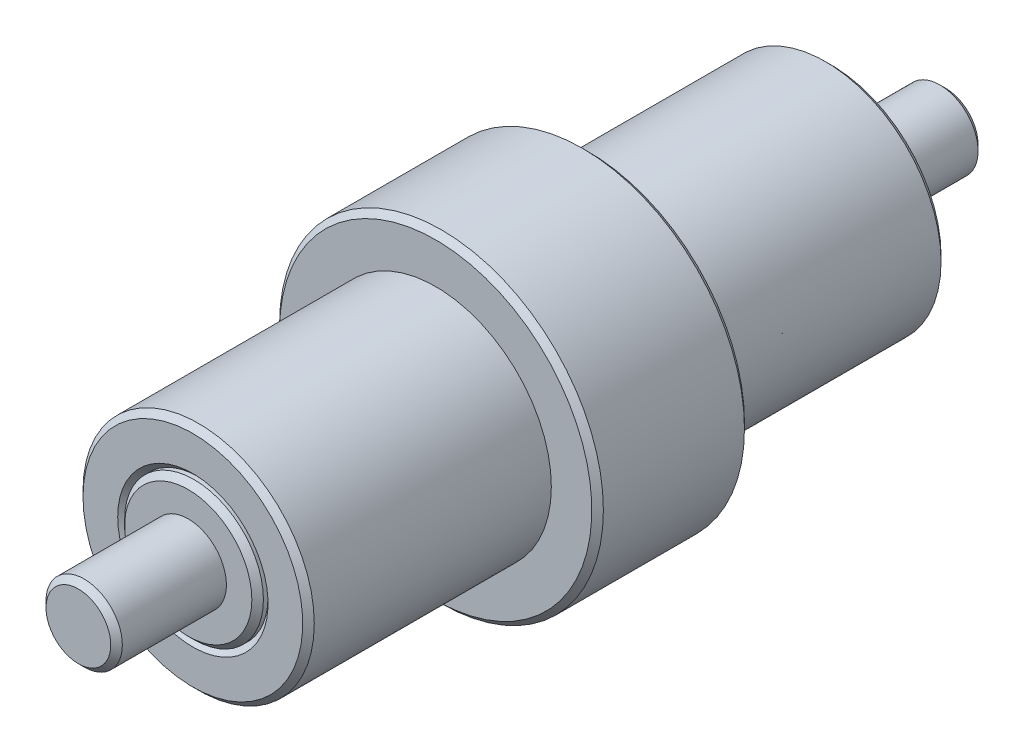
ISO-10303-21;
HEADER;
FILE_DESCRIPTION(('STEP AP214'),'2;1');
FILE_NAME('part.step','',(''),(''),'','','');
FILE_SCHEMA(('AUTOMOTIVE_DESIGN { 1 0 10303 214 1 1 1 1 }'));
ENDSEC;
DATA;
#1=APPLICATION_CONTEXT('core data for automotive mechanical design processes');
#2=APPLICATION_PROTOCOL_DEFINITION('international standard','automotive_design',2000,#1);
#3=PRODUCT_CONTEXT('',#1,'mechanical');
#4=PRODUCT('Part','Part','',(#3));
#5=PRODUCT_RELATED_PRODUCT_CATEGORY('part','',(#4));
#6=PRODUCT_DEFINITION_FORMATION('','',#4);
#7=PRODUCT_DEFINITION_CONTEXT('part definition',#1,'design');
#8=PRODUCT_DEFINITION('design','',#6,#7);
#9=PRODUCT_DEFINITION_SHAPE('','',#8);
#10=(LENGTH_UNIT() NAMED_UNIT(*) SI_UNIT(.MILLI.,.METRE.));
#11=(NAMED_UNIT(*) PLANE_ANGLE_UNIT() SI_UNIT($,.RADIAN.));
#12=(NAMED_UNIT(*) SI_UNIT($,.STERADIAN.) SOLID_ANGLE_UNIT());
#13=UNCERTAINTY_MEASURE_WITH_UNIT(LENGTH_MEASURE(1.E-05),#10,'distance_accuracy_value','');
#14=(GEOMETRIC_REPRESENTATION_CONTEXT(3) GLOBAL_UNCERTAINTY_ASSIGNED_CONTEXT((#13)) GLOBAL_UNIT_ASSIGNED_CONTEXT((#10,
#11,#12)) REPRESENTATION_CONTEXT('',''));
#15=CARTESIAN_POINT('',(0.,0.,0.));
#16=DIRECTION('',(0.,0.,1.));
#17=DIRECTION('',(1.,0.,0.));
#18=AXIS2_PLACEMENT_3D('',#15,#16,#17);
#19=CARTESIAN_POINT('',(0.,0.,13.8));
#20=DIRECTION('',(0.,0.,1.));
#21=DIRECTION('',(1.,0.,0.));
#22=AXIS2_PLACEMENT_3D('',#19,#20,#21);
#23=CYLINDRICAL_SURFACE('',#22,3.);
#24=CARTESIAN_POINT('',(0.,0.,-13.55));
#25=DIRECTION('',(0.,0.,1.));
#26=DIRECTION('',(1.,0.,0.));
#27=AXIS2_PLACEMENT_3D('',#24,#25,#26);
#28=CIRCLE('',#27,3.);
#29=CARTESIAN_POINT('',(3.,0.,-13.55));
#30=VERTEX_POINT('',#29);
#31=EDGE_CURVE('P0_E48',#30,#30,#28,.F.);
#32=ORIENTED_EDGE('',*,*,#31,.T.);
#33=EDGE_LOOP('',(#32));
#34=FACE_BOUND('',#33,.T.);
#35=CARTESIAN_POINT('',(0.,0.,13.55));
#36=DIRECTION('',(0.,0.,-1.));
#37=DIRECTION('',(-1.,0.,0.));
#38=AXIS2_PLACEMENT_3D('',#35,#36,#37);
#39=CIRCLE('',#38,3.);
#40=CARTESIAN_POINT('',(-3.,0.,13.55));
#41=VERTEX_POINT('',#40);
#42=EDGE_CURVE('P0_E51',#41,#41,#39,.F.);
#43=ORIENTED_EDGE('',*,*,#42,.T.);
#44=EDGE_LOOP('',(#43));
#45=FACE_BOUND('',#44,.T.);
#46=ADVANCED_FACE('P0_F15',(#34,#45),#23,.F.);
#47=CARTESIAN_POINT('',(0.,3.,13.8));
#48=DIRECTION('',(0.,0.,-1.));
#49=DIRECTION('',(-1.,0.,0.));
#50=AXIS2_PLACEMENT_3D('',#47,#48,#49);
#51=PLANE('',#50);
#52=CARTESIAN_POINT('',(0.,0.,13.8));
#53=DIRECTION('',(0.,0.,-1.));
#54=DIRECTION('',(-1.,0.,0.));
#55=AXIS2_PLACEMENT_3D('',#52,#53,#54);
#56=CIRCLE('',#55,3.25);
#57=CARTESIAN_POINT('',(-3.25,0.,13.8));
#58=VERTEX_POINT('',#57);
#59=EDGE_CURVE('P0_E27',#58,#58,#56,.T.);
#60=ORIENTED_EDGE('',*,*,#59,.T.);
#61=EDGE_LOOP('',(#60));
#62=FACE_BOUND('',#61,.T.);
#63=CARTESIAN_POINT('',(0.,0.,13.8));
#64=DIRECTION('',(0.,0.,-1.));
#65=DIRECTION('',(-1.,0.,0.));
#66=AXIS2_PLACEMENT_3D('',#63,#64,#65);
#67=CIRCLE('',#66,4.74999999999999);
#68=CARTESIAN_POINT('',(-4.74999999999999,0.,13.8));
#69=VERTEX_POINT('',#68);
#70=EDGE_CURVE('P0_E31',#69,#69,#67,.F.);
#71=ORIENTED_EDGE('',*,*,#70,.T.);
#72=EDGE_LOOP('',(#71));
#73=FACE_BOUND('',#72,.T.);
#74=ADVANCED_FACE('P0_F86',(#62,#73),#51,.F.);
#75=CARTESIAN_POINT('',(0.,0.,13.8));
#76=DIRECTION('',(0.,0.,1.));
#77=DIRECTION('',(1.,0.,0.));
#78=AXIS2_PLACEMENT_3D('',#75,#76,#77);
#79=CYLINDRICAL_SURFACE('',#78,5.);
#80=CARTESIAN_POINT('',(0.,0.,13.55));
#81=DIRECTION('',(0.,0.,-1.));
#82=DIRECTION('',(-1.,0.,0.));
#83=AXIS2_PLACEMENT_3D('',#80,#81,#82);
#84=CIRCLE('',#83,5.);
#85=CARTESIAN_POINT('',(-5.,0.,13.55));
#86=VERTEX_POINT('',#85);
#87=EDGE_CURVE('P0_E23',#86,#86,#84,.T.);
#88=ORIENTED_EDGE('',*,*,#87,.T.);
#89=EDGE_LOOP('',(#88));
#90=FACE_BOUND('',#89,.T.);
#91=CARTESIAN_POINT('',(0.,0.,3.3));
#92=DIRECTION('',(0.,0.,1.));
#93=DIRECTION('',(1.,0.,0.));
#94=AXIS2_PLACEMENT_3D('',#91,#92,#93);
#95=CIRCLE('',#94,5.);
#96=CARTESIAN_POINT('',(5.,0.,3.3));
#97=VERTEX_POINT('',#96);
#98=EDGE_CURVE('P0_E60',#97,#97,#95,.T.);
#99=ORIENTED_EDGE('',*,*,#98,.T.);
#100=EDGE_LOOP('',(#99));
#101=FACE_BOUND('',#100,.T.);
#102=ADVANCED_FACE('P0_F92',(#90,#101),#79,.T.);
#103=CARTESIAN_POINT('',(0.,5.,3.3));
#104=DIRECTION('',(0.,0.,-1.));
#105=DIRECTION('',(-1.,0.,0.));
#106=AXIS2_PLACEMENT_3D('',#103,#104,#105);
#107=PLANE('',#106);
#108=CARTESIAN_POINT('',(0.,0.,3.3));
#109=DIRECTION('',(0.,0.,-1.));
#110=DIRECTION('',(-1.,0.,0.));
#111=AXIS2_PLACEMENT_3D('',#108,#109,#110);
#112=CIRCLE('',#111,6.75);
#113=CARTESIAN_POINT('',(-6.75,0.,3.3));
#114=VERTEX_POINT('',#113);
#115=EDGE_CURVE('P0_E10',#114,#114,#112,.F.);
#116=ORIENTED_EDGE('',*,*,#115,.T.);
#117=EDGE_LOOP('',(#116));
#118=FACE_BOUND('',#117,.T.);
#119=ORIENTED_EDGE('',*,*,#98,.F.);
#120=EDGE_LOOP('',(#119));
#121=FACE_BOUND('',#120,.T.);
#122=ADVANCED_FACE('P0_F144',(#118,#121),#107,.F.);
#123=CARTESIAN_POINT('',(0.,0.,13.8));
#124=DIRECTION('',(0.,0.,1.));
#125=DIRECTION('',(1.,0.,0.));
#126=AXIS2_PLACEMENT_3D('',#123,#124,#125);
#127=CYLINDRICAL_SURFACE('',#126,7.);
#128=CARTESIAN_POINT('',(0.,0.,-3.05));
#129=DIRECTION('',(0.,0.,1.));
#130=DIRECTION('',(1.,0.,0.));
#131=AXIS2_PLACEMENT_3D('',#128,#129,#130);
#132=CIRCLE('',#131,7.);
#133=CARTESIAN_POINT('',(7.,0.,-3.05));
#134=VERTEX_POINT('',#133);
#135=EDGE_CURVE('P0_E39',#134,#134,#132,.T.);
#136=ORIENTED_EDGE('',*,*,#135,.T.);
#137=EDGE_LOOP('',(#136));
#138=FACE_BOUND('',#137,.T.);
#139=CARTESIAN_POINT('',(0.,0.,3.05));
#140=DIRECTION('',(0.,0.,-1.));
#141=DIRECTION('',(-1.,0.,0.));
#142=AXIS2_PLACEMENT_3D('',#139,#140,#141);
#143=CIRCLE('',#142,7.);
#144=CARTESIAN_POINT('',(-7.,0.,3.05));
#145=VERTEX_POINT('',#144);
#146=EDGE_CURVE('P0_E42',#145,#145,#143,.T.);
#147=ORIENTED_EDGE('',*,*,#146,.T.);
#148=EDGE_LOOP('',(#147));
#149=FACE_BOUND('',#148,.T.);
#150=ADVANCED_FACE('P0_F82',(#138,#149),#127,.T.);
#151=CARTESIAN_POINT('',(0.,7.,-3.3));
#152=DIRECTION('',(0.,0.,1.));
#153=DIRECTION('',(1.,0.,0.));
#154=AXIS2_PLACEMENT_3D('',#151,#152,#153);
#155=PLANE('',#154);
#156=CARTESIAN_POINT('',(0.,0.,-3.3));
#157=DIRECTION('',(0.,0.,1.));
#158=DIRECTION('',(1.,0.,0.));
#159=AXIS2_PLACEMENT_3D('',#156,#157,#158);
#160=CIRCLE('',#159,6.75);
#161=CARTESIAN_POINT('',(6.75,0.,-3.3));
#162=VERTEX_POINT('',#161);
#163=EDGE_CURVE('P0_E36',#162,#162,#160,.F.);
#164=ORIENTED_EDGE('',*,*,#163,.T.);
#165=EDGE_LOOP('',(#164));
#166=FACE_BOUND('',#165,.T.);
#167=CARTESIAN_POINT('',(0.,0.,-3.3));
#168=DIRECTION('',(0.,0.,1.));
#169=DIRECTION('',(1.,0.,0.));
#170=AXIS2_PLACEMENT_3D('',#167,#168,#169);
#171=CIRCLE('',#170,5.);
#172=CARTESIAN_POINT('',(5.,0.,-3.3));
#173=VERTEX_POINT('',#172);
#174=EDGE_CURVE('P0_E63',#173,#173,#171,.T.);
#175=ORIENTED_EDGE('',*,*,#174,.T.);
#176=EDGE_LOOP('',(#175));
#177=FACE_BOUND('',#176,.T.);
#178=ADVANCED_FACE('P0_F67',(#166,#177),#155,.F.);
#179=CARTESIAN_POINT('',(0.,0.,13.8));
#180=DIRECTION('',(0.,0.,1.));
#181=DIRECTION('',(1.,0.,0.));
#182=AXIS2_PLACEMENT_3D('',#179,#180,#181);
#183=CYLINDRICAL_SURFACE('',#182,5.);
#184=CARTESIAN_POINT('',(0.,0.,-13.55));
#185=DIRECTION('',(0.,0.,1.));
#186=DIRECTION('',(1.,0.,0.));
#187=AXIS2_PLACEMENT_3D('',#184,#185,#186);
#188=CIRCLE('',#187,5.);
#189=CARTESIAN_POINT('',(5.,0.,-13.55));
#190=VERTEX_POINT('',#189);
#191=EDGE_CURVE('P0_E45',#190,#190,#188,.T.);
#192=ORIENTED_EDGE('',*,*,#191,.T.);
#193=EDGE_LOOP('',(#192));
#194=FACE_BOUND('',#193,.T.);
#195=ORIENTED_EDGE('',*,*,#174,.F.);
#196=EDGE_LOOP('',(#195));
#197=FACE_BOUND('',#196,.T.);
#198=ADVANCED_FACE('P0_F69',(#194,#197),#183,.T.);
#199=CARTESIAN_POINT('',(0.,5.,-13.8));
#200=DIRECTION('',(0.,0.,1.));
#201=DIRECTION('',(1.,0.,0.));
#202=AXIS2_PLACEMENT_3D('',#199,#200,#201);
#203=PLANE('',#202);
#204=CARTESIAN_POINT('',(0.,0.,-13.8));
#205=DIRECTION('',(0.,0.,1.));
#206=DIRECTION('',(1.,0.,0.));
#207=AXIS2_PLACEMENT_3D('',#204,#205,#206);
#208=CIRCLE('',#207,3.25000000000001);
#209=CARTESIAN_POINT('',(3.25000000000001,0.,-13.8));
#210=VERTEX_POINT('',#209);
#211=EDGE_CURVE('P0_E54',#210,#210,#208,.T.);
#212=ORIENTED_EDGE('',*,*,#211,.T.);
#213=EDGE_LOOP('',(#212));
#214=FACE_BOUND('',#213,.T.);
#215=CARTESIAN_POINT('',(0.,0.,-13.8));
#216=DIRECTION('',(0.,0.,1.));
#217=DIRECTION('',(1.,0.,0.));
#218=AXIS2_PLACEMENT_3D('',#215,#216,#217);
#219=CIRCLE('',#218,4.75);
#220=CARTESIAN_POINT('',(4.75,0.,-13.8));
#221=VERTEX_POINT('',#220);
#222=EDGE_CURVE('P0_E57',#221,#221,#219,.F.);
#223=ORIENTED_EDGE('',*,*,#222,.T.);
#224=EDGE_LOOP('',(#223));
#225=FACE_BOUND('',#224,.T.);
#226=ADVANCED_FACE('P0_F71',(#214,#225),#203,.F.);
#227=CARTESIAN_POINT('',(0.,0.,-13.8));
#228=DIRECTION('',(0.,0.,-1.));
#229=DIRECTION('',(-1.,0.,0.));
#230=AXIS2_PLACEMENT_3D('',#227,#228,#229);
#231=CONICAL_SURFACE('',#230,3.25000000000001,0.78539816339745);
#232=ORIENTED_EDGE('',*,*,#31,.F.);
#233=EDGE_LOOP('',(#232));
#234=FACE_BOUND('',#233,.T.);
#235=ORIENTED_EDGE('',*,*,#211,.F.);
#236=EDGE_LOOP('',(#235));
#237=FACE_BOUND('',#236,.T.);
#238=ADVANCED_FACE('P0_F79',(#234,#237),#231,.F.);
#239=CARTESIAN_POINT('',(0.,0.,-13.55));
#240=DIRECTION('',(0.,0.,1.));
#241=DIRECTION('',(1.,0.,0.));
#242=AXIS2_PLACEMENT_3D('',#239,#240,#241);
#243=CONICAL_SURFACE('',#242,5.,0.78539816339744);
#244=ORIENTED_EDGE('',*,*,#222,.F.);
#245=EDGE_LOOP('',(#244));
#246=FACE_BOUND('',#245,.T.);
#247=ORIENTED_EDGE('',*,*,#191,.F.);
#248=EDGE_LOOP('',(#247));
#249=FACE_BOUND('',#248,.T.);
#250=ADVANCED_FACE('P0_F105',(#246,#249),#243,.T.);
#251=CARTESIAN_POINT('',(0.,0.,-3.05));
#252=DIRECTION('',(0.,0.,1.));
#253=DIRECTION('',(1.,0.,0.));
#254=AXIS2_PLACEMENT_3D('',#251,#252,#253);
#255=CONICAL_SURFACE('',#254,7.,0.78539816339745);
#256=ORIENTED_EDGE('',*,*,#163,.F.);
#257=EDGE_LOOP('',(#256));
#258=FACE_BOUND('',#257,.T.);
#259=ORIENTED_EDGE('',*,*,#135,.F.);
#260=EDGE_LOOP('',(#259));
#261=FACE_BOUND('',#260,.T.);
#262=ADVANCED_FACE('P0_F112',(#258,#261),#255,.T.);
#263=CARTESIAN_POINT('',(0.,0.,13.55));
#264=DIRECTION('',(0.,0.,1.));
#265=DIRECTION('',(1.,0.,0.));
#266=AXIS2_PLACEMENT_3D('',#263,#264,#265);
#267=CONICAL_SURFACE('',#266,3.,0.785398163397454);
#268=ORIENTED_EDGE('',*,*,#59,.F.);
#269=EDGE_LOOP('',(#268));
#270=FACE_BOUND('',#269,.T.);
#271=ORIENTED_EDGE('',*,*,#42,.F.);
#272=EDGE_LOOP('',(#271));
#273=FACE_BOUND('',#272,.T.);
#274=ADVANCED_FACE('P0_F119',(#270,#273),#267,.F.);
#275=CARTESIAN_POINT('',(0.,0.,13.8));
#276=DIRECTION('',(0.,0.,-1.));
#277=DIRECTION('',(-1.,0.,0.));
#278=AXIS2_PLACEMENT_3D('',#275,#276,#277);
#279=CONICAL_SURFACE('',#278,4.74999999999999,0.785398163397448);
#280=ORIENTED_EDGE('',*,*,#87,.F.);
#281=EDGE_LOOP('',(#280));
#282=FACE_BOUND('',#281,.T.);
#283=ORIENTED_EDGE('',*,*,#70,.F.);
#284=EDGE_LOOP('',(#283));
#285=FACE_BOUND('',#284,.T.);
#286=ADVANCED_FACE('P0_F125',(#282,#285),#279,.T.);
#287=CARTESIAN_POINT('',(0.,0.,3.3));
#288=DIRECTION('',(0.,0.,-1.));
#289=DIRECTION('',(-1.,0.,0.));
#290=AXIS2_PLACEMENT_3D('',#287,#288,#289);
#291=CONICAL_SURFACE('',#290,6.75,0.78539816339745);
#292=ORIENTED_EDGE('',*,*,#146,.F.);
#293=EDGE_LOOP('',(#292));
#294=FACE_BOUND('',#293,.T.);
#295=ORIENTED_EDGE('',*,*,#115,.F.);
#296=EDGE_LOOP('',(#295));
#297=FACE_BOUND('',#296,.T.);
#298=ADVANCED_FACE('P0_F18',(#294,#297),#291,.T.);
#299=CLOSED_SHELL('',(#46,#74,#102,#122,#150,#178,#198,#226,#238,#250,#262,#274,#286,#298));
#300=MANIFOLD_SOLID_BREP('P0_B1',#299);
#301=CARTESIAN_POINT('',(0.,0.,18.75));
#302=DIRECTION('',(0.,0.,1.));
#303=DIRECTION('',(1.,0.,0.));
#304=AXIS2_PLACEMENT_3D('',#301,#302,#303);
#305=PLANE('',#304);
#306=CARTESIAN_POINT('',(0.,0.,18.75));
#307=DIRECTION('',(0.,0.,1.));
#308=DIRECTION('',(1.,0.,0.));
#309=AXIS2_PLACEMENT_3D('',#306,#307,#308);
#310=CIRCLE('',#309,1.39999999999998);
#311=CARTESIAN_POINT('',(1.39999999999998,0.,18.75));
#312=VERTEX_POINT('',#311);
#313=EDGE_CURVE('P1_E9',#312,#312,#310,.T.);
#314=ORIENTED_EDGE('',*,*,#313,.T.);
#315=EDGE_LOOP('',(#314));
#316=FACE_BOUND('',#315,.T.);
#317=ADVANCED_FACE('P1_F14',(#316),#305,.T.);
#318=CARTESIAN_POINT('',(0.,0.,-18.75));
#319=DIRECTION('',(0.,0.,-1.));
#320=DIRECTION('',(-1.,0.,0.));
#321=AXIS2_PLACEMENT_3D('',#318,#319,#320);
#322=CYLINDRICAL_SURFACE('',#321,1.65);
#323=CARTESIAN_POINT('',(0.,0.,18.5));
#324=DIRECTION('',(0.,0.,1.));
#325=DIRECTION('',(1.,0.,0.));
#326=AXIS2_PLACEMENT_3D('',#323,#324,#325);
#327=CIRCLE('',#326,1.65);
#328=CARTESIAN_POINT('',(1.65,0.,18.5));
#329=VERTEX_POINT('',#328);
#330=EDGE_CURVE('P1_E22',#329,#329,#327,.F.);
#331=ORIENTED_EDGE('',*,*,#330,.T.);
#332=EDGE_LOOP('',(#331));
#333=FACE_BOUND('',#332,.T.);
#334=CARTESIAN_POINT('',(0.,0.,14.));
#335=DIRECTION('',(0.,0.,-1.));
#336=DIRECTION('',(-1.,0.,0.));
#337=AXIS2_PLACEMENT_3D('',#334,#335,#336);
#338=CIRCLE('',#337,1.65);
#339=CARTESIAN_POINT('',(-1.65,0.,14.));
#340=VERTEX_POINT('',#339);
#341=EDGE_CURVE('P1_E47',#340,#340,#338,.T.);
#342=ORIENTED_EDGE('',*,*,#341,.F.);
#343=EDGE_LOOP('',(#342));
#344=FACE_BOUND('',#343,.T.);
#345=ADVANCED_FACE('P1_F73',(#333,#344),#322,.T.);
#346=CARTESIAN_POINT('',(0.,1.65,14.));
#347=DIRECTION('',(0.,0.,1.));
#348=DIRECTION('',(1.,0.,0.));
#349=AXIS2_PLACEMENT_3D('',#346,#347,#348);
#350=PLANE('',#349);
#351=CARTESIAN_POINT('',(0.,0.,14.));
#352=DIRECTION('',(0.,0.,1.));
#353=DIRECTION('',(1.,0.,0.));
#354=AXIS2_PLACEMENT_3D('',#351,#352,#353);
#355=CIRCLE('',#354,2.75);
#356=CARTESIAN_POINT('',(2.75,0.,14.));
#357=VERTEX_POINT('',#356);
#358=EDGE_CURVE('P1_E35',#357,#357,#355,.T.);
#359=ORIENTED_EDGE('',*,*,#358,.T.);
#360=EDGE_LOOP('',(#359));
#361=FACE_BOUND('',#360,.T.);
#362=ORIENTED_EDGE('',*,*,#341,.T.);
#363=EDGE_LOOP('',(#362));
#364=FACE_BOUND('',#363,.T.);
#365=ADVANCED_FACE('P1_F69',(#361,#364),#350,.T.);
#366=CARTESIAN_POINT('',(0.,0.,-18.75));
#367=DIRECTION('',(0.,0.,-1.));
#368=DIRECTION('',(-1.,0.,0.));
#369=AXIS2_PLACEMENT_3D('',#366,#367,#368);
#370=CYLINDRICAL_SURFACE('',#369,3.);
#371=CARTESIAN_POINT('',(0.,0.,-13.75));
#372=DIRECTION('',(0.,0.,-1.));
#373=DIRECTION('',(-1.,0.,0.));
#374=AXIS2_PLACEMENT_3D('',#371,#372,#373);
#375=CIRCLE('',#374,3.);
#376=CARTESIAN_POINT('',(-3.,0.,-13.75));
#377=VERTEX_POINT('',#376);
#378=EDGE_CURVE('P1_E38',#377,#377,#375,.F.);
#379=ORIENTED_EDGE('',*,*,#378,.T.);
#380=EDGE_LOOP('',(#379));
#381=FACE_BOUND('',#380,.T.);
#382=CARTESIAN_POINT('',(0.,0.,13.75));
#383=DIRECTION('',(0.,0.,1.));
#384=DIRECTION('',(1.,0.,0.));
#385=AXIS2_PLACEMENT_3D('',#382,#383,#384);
#386=CIRCLE('',#385,3.);
#387=CARTESIAN_POINT('',(3.,0.,13.75));
#388=VERTEX_POINT('',#387);
#389=EDGE_CURVE('P1_E41',#388,#388,#386,.F.);
#390=ORIENTED_EDGE('',*,*,#389,.T.);
#391=EDGE_LOOP('',(#390));
#392=FACE_BOUND('',#391,.T.);
#393=ADVANCED_FACE('P1_F58',(#381,#392),#370,.T.);
#394=CARTESIAN_POINT('',(0.,3.,-14.));
#395=DIRECTION('',(0.,0.,-1.));
#396=DIRECTION('',(-1.,0.,0.));
#397=AXIS2_PLACEMENT_3D('',#394,#395,#396);
#398=PLANE('',#397);
#399=CARTESIAN_POINT('',(0.,0.,-14.));
#400=DIRECTION('',(0.,0.,-1.));
#401=DIRECTION('',(-1.,0.,0.));
#402=AXIS2_PLACEMENT_3D('',#399,#400,#401);
#403=CIRCLE('',#402,2.75);
#404=CARTESIAN_POINT('',(-2.75,0.,-14.));
#405=VERTEX_POINT('',#404);
#406=EDGE_CURVE('P1_E44',#405,#405,#403,.T.);
#407=ORIENTED_EDGE('',*,*,#406,.T.);
#408=EDGE_LOOP('',(#407));
#409=FACE_BOUND('',#408,.T.);
#410=CARTESIAN_POINT('',(0.,0.,-14.));
#411=DIRECTION('',(0.,0.,-1.));
#412=DIRECTION('',(-1.,0.,0.));
#413=AXIS2_PLACEMENT_3D('',#410,#411,#412);
#414=CIRCLE('',#413,1.65);
#415=CARTESIAN_POINT('',(-1.65,0.,-14.));
#416=VERTEX_POINT('',#415);
#417=EDGE_CURVE('P1_E50',#416,#416,#414,.T.);
#418=ORIENTED_EDGE('',*,*,#417,.F.);
#419=EDGE_LOOP('',(#418));
#420=FACE_BOUND('',#419,.T.);
#421=ADVANCED_FACE('P1_F56',(#409,#420),#398,.T.);
#422=CARTESIAN_POINT('',(0.,0.,-18.75));
#423=DIRECTION('',(0.,0.,-1.));
#424=DIRECTION('',(-1.,0.,0.));
#425=AXIS2_PLACEMENT_3D('',#422,#423,#424);
#426=CYLINDRICAL_SURFACE('',#425,1.65);
#427=CARTESIAN_POINT('',(0.,0.,-18.5));
#428=DIRECTION('',(0.,0.,-1.));
#429=DIRECTION('',(-1.,0.,0.));
#430=AXIS2_PLACEMENT_3D('',#427,#428,#429);
#431=CIRCLE('',#430,1.65);
#432=CARTESIAN_POINT('',(-1.65,0.,-18.5));
#433=VERTEX_POINT('',#432);
#434=EDGE_CURVE('P1_E26',#433,#433,#431,.F.);
#435=ORIENTED_EDGE('',*,*,#434,.T.);
#436=EDGE_LOOP('',(#435));
#437=FACE_BOUND('',#436,.T.);
#438=ORIENTED_EDGE('',*,*,#417,.T.);
#439=EDGE_LOOP('',(#438));
#440=FACE_BOUND('',#439,.T.);
#441=ADVANCED_FACE('P1_F54',(#437,#440),#426,.T.);
#442=CARTESIAN_POINT('',(0.,1.65,-18.75));
#443=DIRECTION('',(0.,0.,-1.));
#444=DIRECTION('',(-1.,0.,0.));
#445=AXIS2_PLACEMENT_3D('',#442,#443,#444);
#446=PLANE('',#445);
#447=CARTESIAN_POINT('',(0.,0.,-18.75));
#448=DIRECTION('',(0.,0.,-1.));
#449=DIRECTION('',(-1.,0.,0.));
#450=AXIS2_PLACEMENT_3D('',#447,#448,#449);
#451=CIRCLE('',#450,1.40000000000001);
#452=CARTESIAN_POINT('',(-1.40000000000001,0.,-18.75));
#453=VERTEX_POINT('',#452);
#454=EDGE_CURVE('P1_E30',#453,#453,#451,.T.);
#455=ORIENTED_EDGE('',*,*,#454,.T.);
#456=EDGE_LOOP('',(#455));
#457=FACE_BOUND('',#456,.T.);
#458=ADVANCED_FACE('P1_F66',(#457),#446,.T.);
#459=CARTESIAN_POINT('',(0.,0.,-14.));
#460=DIRECTION('',(0.,0.,1.));
#461=DIRECTION('',(1.,0.,0.));
#462=AXIS2_PLACEMENT_3D('',#459,#460,#461);
#463=CONICAL_SURFACE('',#462,2.75,0.785398163397447);
#464=ORIENTED_EDGE('',*,*,#378,.F.);
#465=EDGE_LOOP('',(#464));
#466=FACE_BOUND('',#465,.T.);
#467=ORIENTED_EDGE('',*,*,#406,.F.);
#468=EDGE_LOOP('',(#467));
#469=FACE_BOUND('',#468,.T.);
#470=ADVANCED_FACE('P1_F82',(#466,#469),#463,.T.);
#471=CARTESIAN_POINT('',(0.,0.,13.75));
#472=DIRECTION('',(0.,0.,-1.));
#473=DIRECTION('',(-1.,0.,0.));
#474=AXIS2_PLACEMENT_3D('',#471,#472,#473);
#475=CONICAL_SURFACE('',#474,3.,0.785398163397442);
#476=ORIENTED_EDGE('',*,*,#358,.F.);
#477=EDGE_LOOP('',(#476));
#478=FACE_BOUND('',#477,.T.);
#479=ORIENTED_EDGE('',*,*,#389,.F.);
#480=EDGE_LOOP('',(#479));
#481=FACE_BOUND('',#480,.T.);
#482=ADVANCED_FACE('P1_F89',(#478,#481),#475,.T.);
#483=CARTESIAN_POINT('',(0.,0.,-18.75));
#484=DIRECTION('',(0.,0.,1.));
#485=DIRECTION('',(1.,0.,0.));
#486=AXIS2_PLACEMENT_3D('',#483,#484,#485);
#487=CONICAL_SURFACE('',#486,1.40000000000001,0.785398163397436);
#488=ORIENTED_EDGE('',*,*,#434,.F.);
#489=EDGE_LOOP('',(#488));
#490=FACE_BOUND('',#489,.T.);
#491=ORIENTED_EDGE('',*,*,#454,.F.);
#492=EDGE_LOOP('',(#491));
#493=FACE_BOUND('',#492,.T.);
#494=ADVANCED_FACE('P1_F95',(#490,#493),#487,.T.);
#495=CARTESIAN_POINT('',(0.,0.,18.5));
#496=DIRECTION('',(0.,0.,-1.));
#497=DIRECTION('',(-1.,0.,0.));
#498=AXIS2_PLACEMENT_3D('',#495,#496,#497);
#499=CONICAL_SURFACE('',#498,1.65,0.785398163397455);
#500=ORIENTED_EDGE('',*,*,#313,.F.);
#501=EDGE_LOOP('',(#500));
#502=FACE_BOUND('',#501,.T.);
#503=ORIENTED_EDGE('',*,*,#330,.F.);
#504=EDGE_LOOP('',(#503));
#505=FACE_BOUND('',#504,.T.);
#506=ADVANCED_FACE('P1_F17',(#502,#505),#499,.T.);
#507=CLOSED_SHELL('',(#317,#345,#365,#393,#421,#441,#458,#470,#482,#494,#506));
#508=MANIFOLD_SOLID_BREP('P1_B1',#507);
#509=ADVANCED_BREP_SHAPE_REPRESENTATION('',(#18,#300,#508),#14);
#510=SHAPE_DEFINITION_REPRESENTATION(#9,#509);
ENDSEC;
END-ISO-10303-21;
